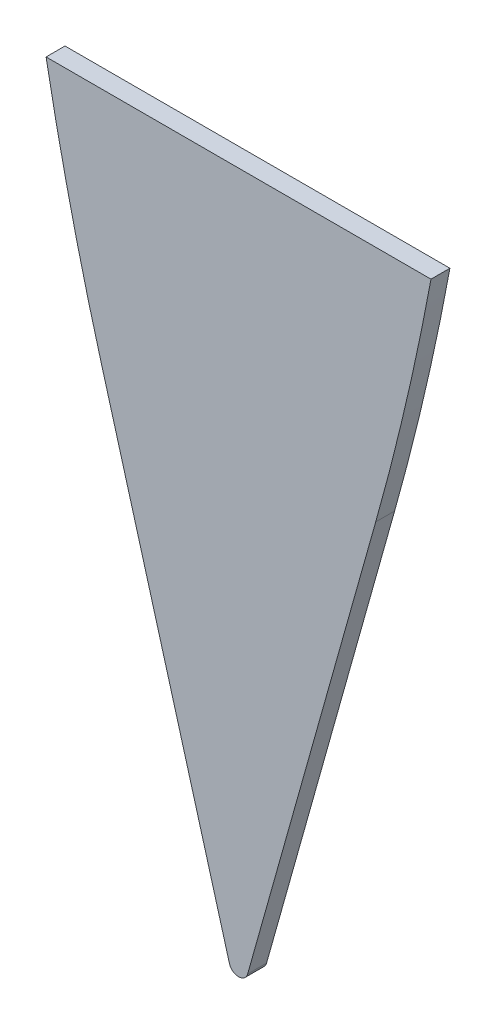
ISO-10303-21;
HEADER;
FILE_DESCRIPTION(('STEP AP214'),'2;1');
FILE_NAME('part.step','',(''),(''),'','','');
FILE_SCHEMA(('AUTOMOTIVE_DESIGN { 1 0 10303 214 1 1 1 1 }'));
ENDSEC;
DATA;
#1=APPLICATION_CONTEXT('core data for automotive mechanical design processes');
#2=APPLICATION_PROTOCOL_DEFINITION('international standard','automotive_design',2000,#1);
#3=PRODUCT_CONTEXT('',#1,'mechanical');
#4=PRODUCT('Part','Part','',(#3));
#5=PRODUCT_RELATED_PRODUCT_CATEGORY('part','',(#4));
#6=PRODUCT_DEFINITION_FORMATION('','',#4);
#7=PRODUCT_DEFINITION_CONTEXT('part definition',#1,'design');
#8=PRODUCT_DEFINITION('design','',#6,#7);
#9=PRODUCT_DEFINITION_SHAPE('','',#8);
#10=(LENGTH_UNIT() NAMED_UNIT(*) SI_UNIT(.MILLI.,.METRE.));
#11=(NAMED_UNIT(*) PLANE_ANGLE_UNIT() SI_UNIT($,.RADIAN.));
#12=(NAMED_UNIT(*) SI_UNIT($,.STERADIAN.) SOLID_ANGLE_UNIT());
#13=UNCERTAINTY_MEASURE_WITH_UNIT(LENGTH_MEASURE(1.E-05),#10,'distance_accuracy_value','');
#14=(GEOMETRIC_REPRESENTATION_CONTEXT(3) GLOBAL_UNCERTAINTY_ASSIGNED_CONTEXT((#13)) GLOBAL_UNIT_ASSIGNED_CONTEXT((#10,
#11,#12)) REPRESENTATION_CONTEXT('',''));
#15=CARTESIAN_POINT('',(0.,0.,0.));
#16=DIRECTION('',(0.,0.,1.));
#17=DIRECTION('',(1.,0.,0.));
#18=AXIS2_PLACEMENT_3D('',#15,#16,#17);
#19=CARTESIAN_POINT('',(-1287.92539340169,-373.27505620024,10.));
#20=DIRECTION('',(0.,0.,-1.));
#21=DIRECTION('',(-1.,0.,0.));
#22=AXIS2_PLACEMENT_3D('',#19,#20,#21);
#23=CYLINDRICAL_SURFACE('',#22,1413.11708487317);
#24=CARTESIAN_POINT('',(-1287.92539340169,-373.27505620024,0.));
#25=DIRECTION('',(0.,0.,1.));
#26=DIRECTION('',(-1.,0.,0.));
#27=AXIS2_PLACEMENT_3D('',#24,#25,#26);
#28=CIRCLE('',#27,1413.11708487317);
#29=CARTESIAN_POINT('',(72.4663381683981,-755.680903744679,0.));
#30=VERTEX_POINT('',#29);
#31=CARTESIAN_POINT('',(101.676059818425,-630.,0.));
#32=VERTEX_POINT('',#31);
#33=EDGE_CURVE('E108',#30,#32,#28,.T.);
#34=ORIENTED_EDGE('',*,*,#33,.T.);
#35=DIRECTION('',(0.,0.,-1.));
#36=VECTOR('',#35,1.);
#37=CARTESIAN_POINT('',(101.676059818425,-630.,10.));
#38=LINE('',#37,#36);
#39=CARTESIAN_POINT('',(101.676059818425,-630.,10.));
#40=VERTEX_POINT('',#39);
#41=EDGE_CURVE('E46',#32,#40,#38,.F.);
#42=ORIENTED_EDGE('',*,*,#41,.T.);
#43=CARTESIAN_POINT('',(-1287.92539340169,-373.27505620024,10.));
#44=DIRECTION('',(0.,0.,1.));
#45=DIRECTION('',(-1.,0.,0.));
#46=AXIS2_PLACEMENT_3D('',#43,#44,#45);
#47=CIRCLE('',#46,1413.11708487317);
#48=CARTESIAN_POINT('',(72.4663381683981,-755.680903744679,10.));
#49=VERTEX_POINT('',#48);
#50=EDGE_CURVE('E117',#49,#40,#47,.T.);
#51=ORIENTED_EDGE('',*,*,#50,.F.);
#52=DIRECTION('',(0.,0.,-1.));
#53=VECTOR('',#52,1.);
#54=CARTESIAN_POINT('',(72.4663381683981,-755.680903744679,10.));
#55=LINE('',#54,#53);
#56=EDGE_CURVE('E118',#49,#30,#55,.T.);
#57=ORIENTED_EDGE('',*,*,#56,.T.);
#58=EDGE_LOOP('',(#34,#42,#51,#57));
#59=FACE_BOUND('',#58,.T.);
#60=ADVANCED_FACE('F33',(#59),#23,.T.);
#61=CARTESIAN_POINT('',(1287.92539340169,-373.27505620024,10.));
#62=DIRECTION('',(0.,0.,-1.));
#63=DIRECTION('',(-1.,0.,0.));
#64=AXIS2_PLACEMENT_3D('',#61,#62,#63);
#65=CYLINDRICAL_SURFACE('',#64,1413.11708487317);
#66=CARTESIAN_POINT('',(1287.92539340169,-373.27505620024,10.));
#67=DIRECTION('',(0.,0.,1.));
#68=DIRECTION('',(1.,0.,0.));
#69=AXIS2_PLACEMENT_3D('',#66,#67,#68);
#70=CIRCLE('',#69,1413.11708487317);
#71=CARTESIAN_POINT('',(-101.676059818425,-630.,10.));
#72=VERTEX_POINT('',#71);
#73=CARTESIAN_POINT('',(-72.4663381683983,-755.680903744679,10.));
#74=VERTEX_POINT('',#73);
#75=EDGE_CURVE('E83',#72,#74,#70,.T.);
#76=ORIENTED_EDGE('',*,*,#75,.F.);
#77=DIRECTION('',(0.,0.,-1.));
#78=VECTOR('',#77,1.);
#79=CARTESIAN_POINT('',(-101.676059818425,-630.,10.));
#80=LINE('',#79,#78);
#81=CARTESIAN_POINT('',(-101.676059818425,-630.,0.));
#82=VERTEX_POINT('',#81);
#83=EDGE_CURVE('E93',#72,#82,#80,.T.);
#84=ORIENTED_EDGE('',*,*,#83,.T.);
#85=CARTESIAN_POINT('',(1287.92539340169,-373.27505620024,0.));
#86=DIRECTION('',(0.,0.,1.));
#87=DIRECTION('',(1.,0.,0.));
#88=AXIS2_PLACEMENT_3D('',#85,#86,#87);
#89=CIRCLE('',#88,1413.11708487317);
#90=CARTESIAN_POINT('',(-72.4663381683983,-755.680903744679,0.));
#91=VERTEX_POINT('',#90);
#92=EDGE_CURVE('E100',#82,#91,#89,.T.);
#93=ORIENTED_EDGE('',*,*,#92,.T.);
#94=DIRECTION('',(0.,0.,-1.));
#95=VECTOR('',#94,1.);
#96=CARTESIAN_POINT('',(-72.4663381683983,-755.680903744679,10.));
#97=LINE('',#96,#95);
#98=EDGE_CURVE('E40',#74,#91,#97,.T.);
#99=ORIENTED_EDGE('',*,*,#98,.F.);
#100=EDGE_LOOP('',(#76,#84,#93,#99));
#101=FACE_BOUND('',#100,.T.);
#102=ADVANCED_FACE('F99',(#101),#65,.T.);
#103=CARTESIAN_POINT('',(-72.4663381683981,-755.680903744679,10.));
#104=DIRECTION('',(0.962688616628103,0.27061158034103,0.));
#105=DIRECTION('',(-0.27061158034103,0.962688616628103,0.));
#106=AXIS2_PLACEMENT_3D('',#103,#104,#105);
#107=PLANE('',#106);
#108=DIRECTION('',(0.27061158034103,-0.962688616628103,0.));
#109=VECTOR('',#108,1.);
#110=CARTESIAN_POINT('',(-72.4663381683981,-755.680903744679,0.));
#111=LINE('',#110,#109);
#112=CARTESIAN_POINT('',(-4.81344308314051,-996.353057901705,0.));
#113=VERTEX_POINT('',#112);
#114=EDGE_CURVE('E107',#91,#113,#111,.T.);
#115=ORIENTED_EDGE('',*,*,#114,.T.);
#116=DIRECTION('',(0.,0.,-1.));
#117=VECTOR('',#116,1.);
#118=CARTESIAN_POINT('',(-4.81344308314051,-996.353057901705,10.));
#119=LINE('',#118,#117);
#120=CARTESIAN_POINT('',(-4.81344308314051,-996.353057901705,10.));
#121=VERTEX_POINT('',#120);
#122=EDGE_CURVE('E122',#121,#113,#119,.T.);
#123=ORIENTED_EDGE('',*,*,#122,.F.);
#124=DIRECTION('',(0.27061158034103,-0.962688616628103,0.));
#125=VECTOR('',#124,1.);
#126=CARTESIAN_POINT('',(-72.4663381683981,-755.680903744679,10.));
#127=LINE('',#126,#125);
#128=EDGE_CURVE('E128',#74,#121,#127,.T.);
#129=ORIENTED_EDGE('',*,*,#128,.F.);
#130=ORIENTED_EDGE('',*,*,#98,.T.);
#131=EDGE_LOOP('',(#115,#123,#129,#130));
#132=FACE_BOUND('',#131,.T.);
#133=ADVANCED_FACE('F126',(#132),#107,.F.);
#134=CARTESIAN_POINT('',(0.,-995.,10.));
#135=DIRECTION('',(0.,0.,-1.));
#136=DIRECTION('',(-1.,0.,0.));
#137=AXIS2_PLACEMENT_3D('',#134,#135,#136);
#138=CYLINDRICAL_SURFACE('',#137,5.);
#139=CARTESIAN_POINT('',(0.,-995.,0.));
#140=DIRECTION('',(0.,0.,1.));
#141=DIRECTION('',(-1.,0.,0.));
#142=AXIS2_PLACEMENT_3D('',#139,#140,#141);
#143=CIRCLE('',#142,5.);
#144=CARTESIAN_POINT('',(4.81344308314052,-996.353057901705,0.));
#145=VERTEX_POINT('',#144);
#146=EDGE_CURVE('E110',#113,#145,#143,.T.);
#147=ORIENTED_EDGE('',*,*,#146,.T.);
#148=DIRECTION('',(0.,0.,-1.));
#149=VECTOR('',#148,1.);
#150=CARTESIAN_POINT('',(4.81344308314052,-996.353057901705,10.));
#151=LINE('',#150,#149);
#152=CARTESIAN_POINT('',(4.81344308314052,-996.353057901705,10.));
#153=VERTEX_POINT('',#152);
#154=EDGE_CURVE('E120',#153,#145,#151,.T.);
#155=ORIENTED_EDGE('',*,*,#154,.F.);
#156=CARTESIAN_POINT('',(0.,-995.,10.));
#157=DIRECTION('',(0.,0.,1.));
#158=DIRECTION('',(-1.,0.,0.));
#159=AXIS2_PLACEMENT_3D('',#156,#157,#158);
#160=CIRCLE('',#159,5.);
#161=EDGE_CURVE('E130',#121,#153,#160,.T.);
#162=ORIENTED_EDGE('',*,*,#161,.F.);
#163=ORIENTED_EDGE('',*,*,#122,.T.);
#164=EDGE_LOOP('',(#147,#155,#162,#163));
#165=FACE_BOUND('',#164,.T.);
#166=ADVANCED_FACE('F142',(#165),#138,.T.);
#167=CARTESIAN_POINT('',(72.4663381683981,-755.680903744679,10.));
#168=DIRECTION('',(-0.962688616628103,0.27061158034103,0.));
#169=DIRECTION('',(-0.27061158034103,-0.962688616628103,0.));
#170=AXIS2_PLACEMENT_3D('',#167,#168,#169);
#171=PLANE('',#170);
#172=DIRECTION('',(0.27061158034103,0.962688616628103,0.));
#173=VECTOR('',#172,1.);
#174=CARTESIAN_POINT('',(72.4663381683981,-755.680903744679,0.));
#175=LINE('',#174,#173);
#176=EDGE_CURVE('E76',#145,#30,#175,.T.);
#177=ORIENTED_EDGE('',*,*,#176,.T.);
#178=ORIENTED_EDGE('',*,*,#56,.F.);
#179=DIRECTION('',(0.27061158034103,0.962688616628103,0.));
#180=VECTOR('',#179,1.);
#181=CARTESIAN_POINT('',(72.4663381683981,-755.680903744679,10.));
#182=LINE('',#181,#180);
#183=EDGE_CURVE('E55',#153,#49,#182,.T.);
#184=ORIENTED_EDGE('',*,*,#183,.F.);
#185=ORIENTED_EDGE('',*,*,#154,.T.);
#186=EDGE_LOOP('',(#177,#178,#184,#185));
#187=FACE_BOUND('',#186,.T.);
#188=ADVANCED_FACE('F143',(#187),#171,.F.);
#189=CARTESIAN_POINT('',(-1287.92539340169,-373.27505620024,10.));
#190=DIRECTION('',(0.,0.,-1.));
#191=DIRECTION('',(-1.,0.,0.));
#192=AXIS2_PLACEMENT_3D('',#189,#190,#191);
#193=PLANE('',#192);
#194=ORIENTED_EDGE('',*,*,#50,.T.);
#195=DIRECTION('',(-1.,0.,0.));
#196=VECTOR('',#195,1.);
#197=CARTESIAN_POINT('',(-125.191691471479,-630.,10.));
#198=LINE('',#197,#196);
#199=EDGE_CURVE('E102',#40,#72,#198,.T.);
#200=ORIENTED_EDGE('',*,*,#199,.T.);
#201=ORIENTED_EDGE('',*,*,#75,.T.);
#202=ORIENTED_EDGE('',*,*,#128,.T.);
#203=ORIENTED_EDGE('',*,*,#161,.T.);
#204=ORIENTED_EDGE('',*,*,#183,.T.);
#205=EDGE_LOOP('',(#194,#200,#201,#202,#203,#204));
#206=FACE_BOUND('',#205,.T.);
#207=ADVANCED_FACE('F137',(#206),#193,.F.);
#208=CARTESIAN_POINT('',(-1287.92539340169,-373.27505620024,0.));
#209=DIRECTION('',(0.,0.,-1.));
#210=DIRECTION('',(-1.,0.,0.));
#211=AXIS2_PLACEMENT_3D('',#208,#209,#210);
#212=PLANE('',#211);
#213=DIRECTION('',(-1.,0.,0.));
#214=VECTOR('',#213,1.);
#215=CARTESIAN_POINT('',(-1287.92539340169,-630.,0.));
#216=LINE('',#215,#214);
#217=EDGE_CURVE('E11',#32,#82,#216,.T.);
#218=ORIENTED_EDGE('',*,*,#217,.F.);
#219=ORIENTED_EDGE('',*,*,#33,.F.);
#220=ORIENTED_EDGE('',*,*,#176,.F.);
#221=ORIENTED_EDGE('',*,*,#146,.F.);
#222=ORIENTED_EDGE('',*,*,#114,.F.);
#223=ORIENTED_EDGE('',*,*,#92,.F.);
#224=EDGE_LOOP('',(#218,#219,#220,#221,#222,#223));
#225=FACE_BOUND('',#224,.T.);
#226=ADVANCED_FACE('F105',(#225),#212,.T.);
#227=CARTESIAN_POINT('',(-125.191691471479,-630.,10.));
#228=DIRECTION('',(0.,-1.,0.));
#229=DIRECTION('',(0.,0.,-1.));
#230=AXIS2_PLACEMENT_3D('',#227,#228,#229);
#231=PLANE('',#230);
#232=ORIENTED_EDGE('',*,*,#217,.T.);
#233=ORIENTED_EDGE('',*,*,#83,.F.);
#234=ORIENTED_EDGE('',*,*,#199,.F.);
#235=ORIENTED_EDGE('',*,*,#41,.F.);
#236=EDGE_LOOP('',(#232,#233,#234,#235));
#237=FACE_BOUND('',#236,.T.);
#238=ADVANCED_FACE('F92',(#237),#231,.F.);
#239=CLOSED_SHELL('',(#60,#102,#133,#166,#188,#207,#226,#238));
#240=MANIFOLD_SOLID_BREP('B2',#239);
#241=ADVANCED_BREP_SHAPE_REPRESENTATION('',(#18,#240),#14);
#242=SHAPE_DEFINITION_REPRESENTATION(#9,#241);
ENDSEC;
END-ISO-10303-21;
